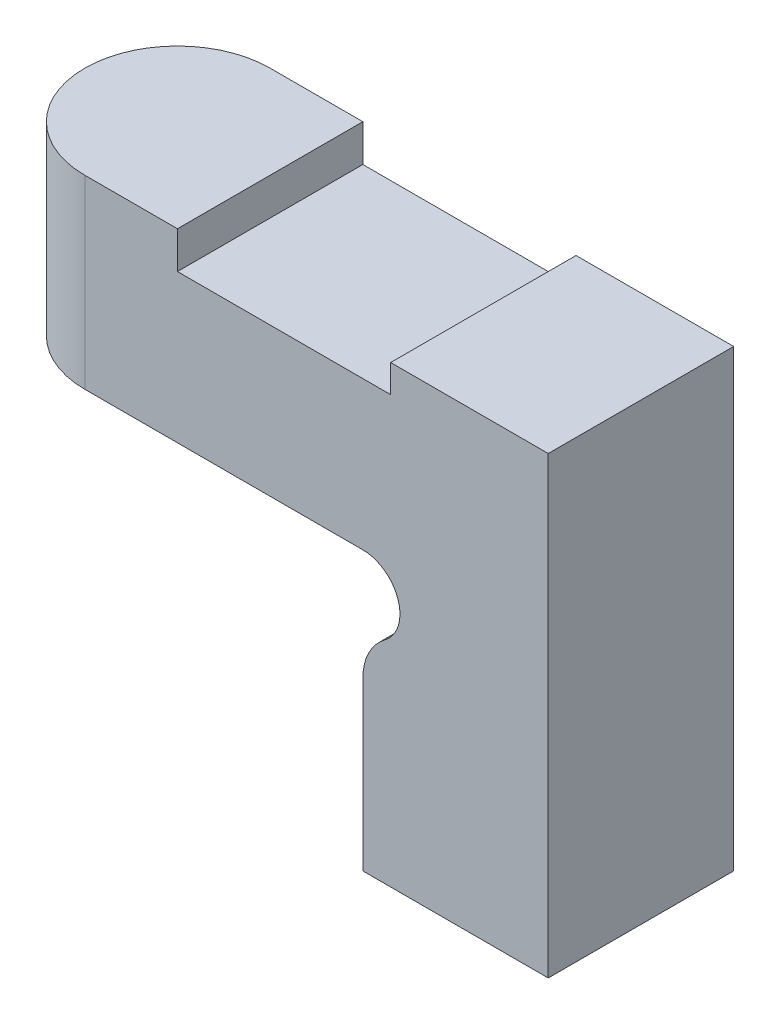
ISO-10303-21;
HEADER;
FILE_DESCRIPTION(('STEP AP214'),'2;1');
FILE_NAME('part.step','',(''),(''),'','','');
FILE_SCHEMA(('AUTOMOTIVE_DESIGN { 1 0 10303 214 1 1 1 1 }'));
ENDSEC;
DATA;
#1=APPLICATION_CONTEXT('core data for automotive mechanical design processes');
#2=APPLICATION_PROTOCOL_DEFINITION('international standard','automotive_design',2000,#1);
#3=PRODUCT_CONTEXT('',#1,'mechanical');
#4=PRODUCT('Part','Part','',(#3));
#5=PRODUCT_RELATED_PRODUCT_CATEGORY('part','',(#4));
#6=PRODUCT_DEFINITION_FORMATION('','',#4);
#7=PRODUCT_DEFINITION_CONTEXT('part definition',#1,'design');
#8=PRODUCT_DEFINITION('design','',#6,#7);
#9=PRODUCT_DEFINITION_SHAPE('','',#8);
#10=(LENGTH_UNIT() NAMED_UNIT(*) SI_UNIT(.MILLI.,.METRE.));
#11=(NAMED_UNIT(*) PLANE_ANGLE_UNIT() SI_UNIT($,.RADIAN.));
#12=(NAMED_UNIT(*) SI_UNIT($,.STERADIAN.) SOLID_ANGLE_UNIT());
#13=UNCERTAINTY_MEASURE_WITH_UNIT(LENGTH_MEASURE(1.E-05),#10,'distance_accuracy_value','');
#14=(GEOMETRIC_REPRESENTATION_CONTEXT(3) GLOBAL_UNCERTAINTY_ASSIGNED_CONTEXT((#13)) GLOBAL_UNIT_ASSIGNED_CONTEXT((#10,
#11,#12)) REPRESENTATION_CONTEXT('',''));
#15=CARTESIAN_POINT('',(0.,0.,0.));
#16=DIRECTION('',(0.,0.,1.));
#17=DIRECTION('',(1.,0.,0.));
#18=AXIS2_PLACEMENT_3D('',#15,#16,#17);
#19=CARTESIAN_POINT('',(20.,10.,0.));
#20=DIRECTION('',(0.,0.,1.));
#21=DIRECTION('',(-1.,0.,0.));
#22=AXIS2_PLACEMENT_3D('',#19,#20,#21);
#23=PLANE('',#22);
#24=CARTESIAN_POINT('',(25.,-10.,0.));
#25=DIRECTION('',(0.,0.,1.));
#26=DIRECTION('',(1.,0.,0.));
#27=AXIS2_PLACEMENT_3D('',#24,#25,#26);
#28=CIRCLE('',#27,2.);
#29=CARTESIAN_POINT('',(27.,-10.,0.));
#30=VERTEX_POINT('',#29);
#31=EDGE_CURVE('E187',#30,#30,#28,.T.);
#32=ORIENTED_EDGE('',*,*,#31,.T.);
#33=EDGE_LOOP('',(#32));
#34=FACE_BOUND('',#33,.T.);
#35=CARTESIAN_POINT('',(25.,3.,0.));
#36=DIRECTION('',(0.,0.,1.));
#37=DIRECTION('',(1.,0.,0.));
#38=AXIS2_PLACEMENT_3D('',#35,#36,#37);
#39=CIRCLE('',#38,2.);
#40=CARTESIAN_POINT('',(27.,3.,0.));
#41=VERTEX_POINT('',#40);
#42=EDGE_CURVE('E190',#41,#41,#39,.T.);
#43=ORIENTED_EDGE('',*,*,#42,.T.);
#44=EDGE_LOOP('',(#43));
#45=FACE_BOUND('',#44,.T.);
#46=CARTESIAN_POINT('',(20.,-2.,0.));
#47=DIRECTION('',(0.,0.,-1.));
#48=DIRECTION('',(-1.,0.,0.));
#49=AXIS2_PLACEMENT_3D('',#46,#47,#48);
#50=CIRCLE('',#49,2.);
#51=CARTESIAN_POINT('',(20.,0.,0.));
#52=VERTEX_POINT('',#51);
#53=CARTESIAN_POINT('',(21.2,-3.6,0.));
#54=VERTEX_POINT('',#53);
#55=EDGE_CURVE('E147',#52,#54,#50,.T.);
#56=ORIENTED_EDGE('',*,*,#55,.F.);
#57=DIRECTION('',(1.,0.,0.));
#58=VECTOR('',#57,1.);
#59=CARTESIAN_POINT('',(20.,0.,0.));
#60=LINE('',#59,#58);
#61=CARTESIAN_POINT('',(5.,0.,0.));
#62=VERTEX_POINT('',#61);
#63=EDGE_CURVE('E136',#62,#52,#60,.T.);
#64=ORIENTED_EDGE('',*,*,#63,.F.);
#65=DIRECTION('',(0.,-1.,0.));
#66=VECTOR('',#65,1.);
#67=CARTESIAN_POINT('',(5.,10.,0.));
#68=LINE('',#67,#66);
#69=CARTESIAN_POINT('',(5.,10.,0.));
#70=VERTEX_POINT('',#69);
#71=EDGE_CURVE('E171',#70,#62,#68,.T.);
#72=ORIENTED_EDGE('',*,*,#71,.F.);
#73=DIRECTION('',(1.,0.,0.));
#74=VECTOR('',#73,1.);
#75=CARTESIAN_POINT('',(0.,10.,0.));
#76=LINE('',#75,#74);
#77=CARTESIAN_POINT('',(10.,10.,0.));
#78=VERTEX_POINT('',#77);
#79=EDGE_CURVE('E154',#70,#78,#76,.T.);
#80=ORIENTED_EDGE('',*,*,#79,.T.);
#81=DIRECTION('',(0.,1.,0.));
#82=VECTOR('',#81,1.);
#83=CARTESIAN_POINT('',(10.,10.,0.));
#84=LINE('',#83,#82);
#85=CARTESIAN_POINT('',(10.,8.,0.));
#86=VERTEX_POINT('',#85);
#87=EDGE_CURVE('E231',#86,#78,#84,.T.);
#88=ORIENTED_EDGE('',*,*,#87,.F.);
#89=DIRECTION('',(-1.,0.,0.));
#90=VECTOR('',#89,1.);
#91=CARTESIAN_POINT('',(20.,8.,0.));
#92=LINE('',#91,#90);
#93=CARTESIAN_POINT('',(21.5,8.,0.));
#94=VERTEX_POINT('',#93);
#95=EDGE_CURVE('E159',#94,#86,#92,.T.);
#96=ORIENTED_EDGE('',*,*,#95,.F.);
#97=DIRECTION('',(0.,-1.,0.));
#98=VECTOR('',#97,1.);
#99=CARTESIAN_POINT('',(21.5,10.,0.));
#100=LINE('',#99,#98);
#101=CARTESIAN_POINT('',(21.5,9.5,0.));
#102=VERTEX_POINT('',#101);
#103=EDGE_CURVE('E236',#102,#94,#100,.T.);
#104=ORIENTED_EDGE('',*,*,#103,.F.);
#105=DIRECTION('',(1.,0.,0.));
#106=VECTOR('',#105,1.);
#107=CARTESIAN_POINT('',(21.5,9.5,0.));
#108=LINE('',#107,#106);
#109=CARTESIAN_POINT('',(30.,9.5,0.));
#110=VERTEX_POINT('',#109);
#111=EDGE_CURVE('E184',#102,#110,#108,.T.);
#112=ORIENTED_EDGE('',*,*,#111,.T.);
#113=DIRECTION('',(0.,-1.,0.));
#114=VECTOR('',#113,1.);
#115=CARTESIAN_POINT('',(30.,10.,0.));
#116=LINE('',#115,#114);
#117=CARTESIAN_POINT('',(30.,-15.,0.));
#118=VERTEX_POINT('',#117);
#119=EDGE_CURVE('E245',#110,#118,#116,.T.);
#120=ORIENTED_EDGE('',*,*,#119,.T.);
#121=DIRECTION('',(-1.,0.,0.));
#122=VECTOR('',#121,1.);
#123=CARTESIAN_POINT('',(20.,-15.,0.));
#124=LINE('',#123,#122);
#125=CARTESIAN_POINT('',(20.,-15.,0.));
#126=VERTEX_POINT('',#125);
#127=EDGE_CURVE('E203',#118,#126,#124,.T.);
#128=ORIENTED_EDGE('',*,*,#127,.T.);
#129=DIRECTION('',(0.,1.,0.));
#130=VECTOR('',#129,1.);
#131=CARTESIAN_POINT('',(20.,-15.,0.));
#132=LINE('',#131,#130);
#133=CARTESIAN_POINT('',(20.,-6.00000000000001,0.));
#134=VERTEX_POINT('',#133);
#135=EDGE_CURVE('E206',#126,#134,#132,.T.);
#136=ORIENTED_EDGE('',*,*,#135,.T.);
#137=CARTESIAN_POINT('',(23.,-6.,0.));
#138=DIRECTION('',(0.,0.,-1.));
#139=DIRECTION('',(-1.,0.,0.));
#140=AXIS2_PLACEMENT_3D('',#137,#138,#139);
#141=CIRCLE('',#140,3.);
#142=EDGE_CURVE('E11',#54,#134,#141,.F.);
#143=ORIENTED_EDGE('',*,*,#142,.F.);
#144=EDGE_LOOP('',(#56,#64,#72,#80,#88,#96,#104,#112,#120,#128,#136,#143));
#145=FACE_BOUND('',#144,.T.);
#146=ADVANCED_FACE('F35',(#34,#45,#145),#23,.F.);
#147=CARTESIAN_POINT('',(30.,10.,0.));
#148=DIRECTION('',(-1.,0.,0.));
#149=DIRECTION('',(0.,0.,-1.));
#150=AXIS2_PLACEMENT_3D('',#147,#148,#149);
#151=PLANE('',#150);
#152=DIRECTION('',(0.,0.,1.));
#153=VECTOR('',#152,1.);
#154=CARTESIAN_POINT('',(30.,9.5,0.));
#155=LINE('',#154,#153);
#156=CARTESIAN_POINT('',(30.,9.5,10.));
#157=VERTEX_POINT('',#156);
#158=EDGE_CURVE('E146',#110,#157,#155,.T.);
#159=ORIENTED_EDGE('',*,*,#158,.T.);
#160=DIRECTION('',(0.,-1.,0.));
#161=VECTOR('',#160,1.);
#162=CARTESIAN_POINT('',(30.,10.,10.));
#163=LINE('',#162,#161);
#164=CARTESIAN_POINT('',(30.,-15.,10.));
#165=VERTEX_POINT('',#164);
#166=EDGE_CURVE('E241',#157,#165,#163,.T.);
#167=ORIENTED_EDGE('',*,*,#166,.T.);
#168=DIRECTION('',(0.,0.,-1.));
#169=VECTOR('',#168,1.);
#170=CARTESIAN_POINT('',(30.,-15.,0.));
#171=LINE('',#170,#169);
#172=EDGE_CURVE('E201',#165,#118,#171,.T.);
#173=ORIENTED_EDGE('',*,*,#172,.T.);
#174=ORIENTED_EDGE('',*,*,#119,.F.);
#175=EDGE_LOOP('',(#159,#167,#173,#174));
#176=FACE_BOUND('',#175,.T.);
#177=ADVANCED_FACE('F277',(#176),#151,.F.);
#178=CARTESIAN_POINT('',(0.,10.,10.));
#179=DIRECTION('',(0.,0.,-1.));
#180=DIRECTION('',(1.,0.,0.));
#181=AXIS2_PLACEMENT_3D('',#178,#179,#180);
#182=PLANE('',#181);
#183=DIRECTION('',(0.,1.,0.));
#184=VECTOR('',#183,1.);
#185=CARTESIAN_POINT('',(20.,-15.,10.));
#186=LINE('',#185,#184);
#187=CARTESIAN_POINT('',(20.,-15.,10.));
#188=VERTEX_POINT('',#187);
#189=CARTESIAN_POINT('',(20.,-6.00000000000001,10.));
#190=VERTEX_POINT('',#189);
#191=EDGE_CURVE('E209',#188,#190,#186,.T.);
#192=ORIENTED_EDGE('',*,*,#191,.F.);
#193=DIRECTION('',(1.,0.,0.));
#194=VECTOR('',#193,1.);
#195=CARTESIAN_POINT('',(20.,-15.,10.));
#196=LINE('',#195,#194);
#197=EDGE_CURVE('E199',#188,#165,#196,.T.);
#198=ORIENTED_EDGE('',*,*,#197,.T.);
#199=ORIENTED_EDGE('',*,*,#166,.F.);
#200=DIRECTION('',(-1.,0.,0.));
#201=VECTOR('',#200,1.);
#202=CARTESIAN_POINT('',(30.,9.5,10.));
#203=LINE('',#202,#201);
#204=CARTESIAN_POINT('',(21.5,9.5,10.));
#205=VERTEX_POINT('',#204);
#206=EDGE_CURVE('E179',#157,#205,#203,.T.);
#207=ORIENTED_EDGE('',*,*,#206,.T.);
#208=DIRECTION('',(0.,1.,0.));
#209=VECTOR('',#208,1.);
#210=CARTESIAN_POINT('',(21.5,8.,10.));
#211=LINE('',#210,#209);
#212=CARTESIAN_POINT('',(21.5,8.,10.));
#213=VERTEX_POINT('',#212);
#214=EDGE_CURVE('E226',#213,#205,#211,.T.);
#215=ORIENTED_EDGE('',*,*,#214,.F.);
#216=DIRECTION('',(-1.,0.,0.));
#217=VECTOR('',#216,1.);
#218=CARTESIAN_POINT('',(21.5,8.,10.));
#219=LINE('',#218,#217);
#220=CARTESIAN_POINT('',(10.,8.,10.));
#221=VERTEX_POINT('',#220);
#222=EDGE_CURVE('E220',#213,#221,#219,.T.);
#223=ORIENTED_EDGE('',*,*,#222,.T.);
#224=DIRECTION('',(0.,1.,0.));
#225=VECTOR('',#224,1.);
#226=CARTESIAN_POINT('',(10.,8.,10.));
#227=LINE('',#226,#225);
#228=CARTESIAN_POINT('',(10.,10.,10.));
#229=VERTEX_POINT('',#228);
#230=EDGE_CURVE('E228',#221,#229,#227,.T.);
#231=ORIENTED_EDGE('',*,*,#230,.T.);
#232=DIRECTION('',(-1.,0.,0.));
#233=VECTOR('',#232,1.);
#234=CARTESIAN_POINT('',(0.,10.,10.));
#235=LINE('',#234,#233);
#236=CARTESIAN_POINT('',(5.,10.,10.));
#237=VERTEX_POINT('',#236);
#238=EDGE_CURVE('E157',#229,#237,#235,.T.);
#239=ORIENTED_EDGE('',*,*,#238,.T.);
#240=DIRECTION('',(0.,-1.,0.));
#241=VECTOR('',#240,1.);
#242=CARTESIAN_POINT('',(5.,10.,10.));
#243=LINE('',#242,#241);
#244=CARTESIAN_POINT('',(5.,0.,10.));
#245=VERTEX_POINT('',#244);
#246=EDGE_CURVE('E153',#245,#237,#243,.F.);
#247=ORIENTED_EDGE('',*,*,#246,.F.);
#248=DIRECTION('',(-1.,0.,0.));
#249=VECTOR('',#248,1.);
#250=CARTESIAN_POINT('',(0.,0.,10.));
#251=LINE('',#250,#249);
#252=CARTESIAN_POINT('',(20.,0.,10.0000065));
#253=VERTEX_POINT('',#252);
#254=EDGE_CURVE('E133',#253,#245,#251,.T.);
#255=ORIENTED_EDGE('',*,*,#254,.F.);
#256=CARTESIAN_POINT('',(20.,-2.,10.));
#257=DIRECTION('',(0.,0.,1.));
#258=DIRECTION('',(1.,0.,0.));
#259=AXIS2_PLACEMENT_3D('',#256,#257,#258);
#260=CIRCLE('',#259,2.);
#261=CARTESIAN_POINT('',(21.2,-3.6,10.));
#262=VERTEX_POINT('',#261);
#263=EDGE_CURVE('E142',#262,#253,#260,.T.);
#264=ORIENTED_EDGE('',*,*,#263,.F.);
#265=CARTESIAN_POINT('',(23.,-6.,10.));
#266=DIRECTION('',(0.,0.,1.));
#267=DIRECTION('',(1.,0.,0.));
#268=AXIS2_PLACEMENT_3D('',#265,#266,#267);
#269=CIRCLE('',#268,3.);
#270=EDGE_CURVE('E170',#190,#262,#269,.F.);
#271=ORIENTED_EDGE('',*,*,#270,.F.);
#272=EDGE_LOOP('',(#192,#198,#199,#207,#215,#223,#231,#239,#247,#255,#264,#271));
#273=FACE_BOUND('',#272,.T.);
#274=ADVANCED_FACE('F150',(#273),#182,.F.);
#275=CARTESIAN_POINT('',(21.5,8.,10.));
#276=DIRECTION('',(1.,0.,0.));
#277=DIRECTION('',(0.,0.,1.));
#278=AXIS2_PLACEMENT_3D('',#275,#276,#277);
#279=PLANE('',#278);
#280=DIRECTION('',(0.,0.,-1.));
#281=VECTOR('',#280,1.);
#282=CARTESIAN_POINT('',(21.5,9.5,10.));
#283=LINE('',#282,#281);
#284=EDGE_CURVE('E182',#205,#102,#283,.T.);
#285=ORIENTED_EDGE('',*,*,#284,.T.);
#286=ORIENTED_EDGE('',*,*,#103,.T.);
#287=DIRECTION('',(0.,0.,1.));
#288=VECTOR('',#287,1.);
#289=CARTESIAN_POINT('',(21.5,8.,10.));
#290=LINE('',#289,#288);
#291=EDGE_CURVE('E218',#94,#213,#290,.T.);
#292=ORIENTED_EDGE('',*,*,#291,.T.);
#293=ORIENTED_EDGE('',*,*,#214,.T.);
#294=EDGE_LOOP('',(#285,#286,#292,#293));
#295=FACE_BOUND('',#294,.T.);
#296=ADVANCED_FACE('F283',(#295),#279,.F.);
#297=CARTESIAN_POINT('',(0.,10.,0.));
#298=DIRECTION('',(0.,-1.,0.));
#299=DIRECTION('',(0.,0.,1.));
#300=AXIS2_PLACEMENT_3D('',#297,#298,#299);
#301=PLANE('',#300);
#302=ORIENTED_EDGE('',*,*,#238,.F.);
#303=DIRECTION('',(0.,0.,-1.));
#304=VECTOR('',#303,1.);
#305=CARTESIAN_POINT('',(10.,10.,10.));
#306=LINE('',#305,#304);
#307=EDGE_CURVE('E221',#229,#78,#306,.T.);
#308=ORIENTED_EDGE('',*,*,#307,.T.);
#309=ORIENTED_EDGE('',*,*,#79,.F.);
#310=CARTESIAN_POINT('',(5.,10.,5.));
#311=DIRECTION('',(0.,1.,0.));
#312=DIRECTION('',(0.,0.,1.));
#313=AXIS2_PLACEMENT_3D('',#310,#311,#312);
#314=CIRCLE('',#313,5.);
#315=CARTESIAN_POINT('',(0.,10.,5.));
#316=VERTEX_POINT('',#315);
#317=EDGE_CURVE('E254',#316,#70,#314,.F.);
#318=ORIENTED_EDGE('',*,*,#317,.F.);
#319=CARTESIAN_POINT('',(5.,10.,5.));
#320=DIRECTION('',(0.,1.,0.));
#321=DIRECTION('',(0.,0.,1.));
#322=AXIS2_PLACEMENT_3D('',#319,#320,#321);
#323=CIRCLE('',#322,5.);
#324=EDGE_CURVE('E256',#237,#316,#323,.F.);
#325=ORIENTED_EDGE('',*,*,#324,.F.);
#326=EDGE_LOOP('',(#302,#308,#309,#318,#325));
#327=FACE_BOUND('',#326,.T.);
#328=ADVANCED_FACE('F294',(#327),#301,.F.);
#329=CARTESIAN_POINT('',(0.,0.,0.));
#330=DIRECTION('',(0.,-1.,0.));
#331=DIRECTION('',(0.,0.,1.));
#332=AXIS2_PLACEMENT_3D('',#329,#330,#331);
#333=PLANE('',#332);
#334=DIRECTION('',(0.,0.,1.));
#335=VECTOR('',#334,1.);
#336=CARTESIAN_POINT('',(20.,0.,0.));
#337=LINE('',#336,#335);
#338=EDGE_CURVE('E128',#52,#253,#337,.T.);
#339=ORIENTED_EDGE('',*,*,#338,.T.);
#340=ORIENTED_EDGE('',*,*,#254,.T.);
#341=CARTESIAN_POINT('',(5.,0.,5.));
#342=DIRECTION('',(0.,1.,0.));
#343=DIRECTION('',(0.,0.,1.));
#344=AXIS2_PLACEMENT_3D('',#341,#342,#343);
#345=CIRCLE('',#344,5.);
#346=CARTESIAN_POINT('',(0.,0.,5.));
#347=VERTEX_POINT('',#346);
#348=EDGE_CURVE('E251',#347,#245,#345,.T.);
#349=ORIENTED_EDGE('',*,*,#348,.F.);
#350=CARTESIAN_POINT('',(5.,0.,5.));
#351=DIRECTION('',(0.,1.,0.));
#352=DIRECTION('',(0.,0.,1.));
#353=AXIS2_PLACEMENT_3D('',#350,#351,#352);
#354=CIRCLE('',#353,5.);
#355=EDGE_CURVE('E248',#62,#347,#354,.T.);
#356=ORIENTED_EDGE('',*,*,#355,.F.);
#357=ORIENTED_EDGE('',*,*,#63,.T.);
#358=EDGE_LOOP('',(#339,#340,#349,#356,#357));
#359=FACE_BOUND('',#358,.T.);
#360=CARTESIAN_POINT('',(6.5,0.,5.));
#361=DIRECTION('',(0.,1.,0.));
#362=DIRECTION('',(0.,0.,1.));
#363=AXIS2_PLACEMENT_3D('',#360,#361,#362);
#364=CIRCLE('',#363,2.15);
#365=CARTESIAN_POINT('',(6.5,0.,7.15));
#366=VERTEX_POINT('',#365);
#367=EDGE_CURVE('E212',#366,#366,#364,.T.);
#368=ORIENTED_EDGE('',*,*,#367,.T.);
#369=EDGE_LOOP('',(#368));
#370=FACE_BOUND('',#369,.T.);
#371=ADVANCED_FACE('F129',(#359,#370),#333,.T.);
#372=CARTESIAN_POINT('',(0.,8.,0.));
#373=DIRECTION('',(0.,-1.,0.));
#374=DIRECTION('',(0.,0.,1.));
#375=AXIS2_PLACEMENT_3D('',#372,#373,#374);
#376=PLANE('',#375);
#377=ORIENTED_EDGE('',*,*,#291,.F.);
#378=ORIENTED_EDGE('',*,*,#95,.T.);
#379=DIRECTION('',(0.,0.,-1.));
#380=VECTOR('',#379,1.);
#381=CARTESIAN_POINT('',(10.,8.,10.));
#382=LINE('',#381,#380);
#383=EDGE_CURVE('E224',#221,#86,#382,.T.);
#384=ORIENTED_EDGE('',*,*,#383,.F.);
#385=ORIENTED_EDGE('',*,*,#222,.F.);
#386=EDGE_LOOP('',(#377,#378,#384,#385));
#387=FACE_BOUND('',#386,.T.);
#388=ADVANCED_FACE('F287',(#387),#376,.F.);
#389=CARTESIAN_POINT('',(10.,8.,10.));
#390=DIRECTION('',(-1.,0.,0.));
#391=DIRECTION('',(0.,0.,-1.));
#392=AXIS2_PLACEMENT_3D('',#389,#390,#391);
#393=PLANE('',#392);
#394=ORIENTED_EDGE('',*,*,#383,.T.);
#395=ORIENTED_EDGE('',*,*,#87,.T.);
#396=ORIENTED_EDGE('',*,*,#307,.F.);
#397=ORIENTED_EDGE('',*,*,#230,.F.);
#398=EDGE_LOOP('',(#394,#395,#396,#397));
#399=FACE_BOUND('',#398,.T.);
#400=ADVANCED_FACE('F291',(#399),#393,.F.);
#401=CARTESIAN_POINT('',(5.,10.,5.));
#402=DIRECTION('',(0.,-1.,0.));
#403=DIRECTION('',(0.,0.,1.));
#404=AXIS2_PLACEMENT_3D('',#401,#402,#403);
#405=CYLINDRICAL_SURFACE('',#404,5.);
#406=ORIENTED_EDGE('',*,*,#71,.T.);
#407=ORIENTED_EDGE('',*,*,#355,.T.);
#408=DIRECTION('',(0.,-1.,0.));
#409=VECTOR('',#408,1.);
#410=CARTESIAN_POINT('',(0.,10.,5.));
#411=LINE('',#410,#409);
#412=EDGE_CURVE('E163',#347,#316,#411,.F.);
#413=ORIENTED_EDGE('',*,*,#412,.T.);
#414=ORIENTED_EDGE('',*,*,#317,.T.);
#415=EDGE_LOOP('',(#406,#407,#413,#414));
#416=FACE_BOUND('',#415,.T.);
#417=ADVANCED_FACE('F261',(#416),#405,.T.);
#418=CARTESIAN_POINT('',(5.,10.,5.));
#419=DIRECTION('',(0.,-1.,0.));
#420=DIRECTION('',(0.,0.,1.));
#421=AXIS2_PLACEMENT_3D('',#418,#419,#420);
#422=CYLINDRICAL_SURFACE('',#421,5.);
#423=ORIENTED_EDGE('',*,*,#324,.T.);
#424=ORIENTED_EDGE('',*,*,#412,.F.);
#425=ORIENTED_EDGE('',*,*,#348,.T.);
#426=ORIENTED_EDGE('',*,*,#246,.T.);
#427=EDGE_LOOP('',(#423,#424,#425,#426));
#428=FACE_BOUND('',#427,.T.);
#429=ADVANCED_FACE('F296',(#428),#422,.T.);
#430=CARTESIAN_POINT('',(6.5,5.,5.));
#431=DIRECTION('',(0.,-1.,0.));
#432=DIRECTION('',(0.,0.,1.));
#433=AXIS2_PLACEMENT_3D('',#430,#431,#432);
#434=CYLINDRICAL_SURFACE('',#433,2.15);
#435=CARTESIAN_POINT('',(6.5,5.,5.));
#436=DIRECTION('',(0.,1.,0.));
#437=DIRECTION('',(0.,0.,1.));
#438=AXIS2_PLACEMENT_3D('',#435,#436,#437);
#439=CIRCLE('',#438,2.15);
#440=CARTESIAN_POINT('',(6.5,5.,7.15));
#441=VERTEX_POINT('',#440);
#442=EDGE_CURVE('E213',#441,#441,#439,.T.);
#443=ORIENTED_EDGE('',*,*,#442,.T.);
#444=EDGE_LOOP('',(#443));
#445=FACE_BOUND('',#444,.T.);
#446=ORIENTED_EDGE('',*,*,#367,.F.);
#447=EDGE_LOOP('',(#446));
#448=FACE_BOUND('',#447,.T.);
#449=ADVANCED_FACE('F298',(#445,#448),#434,.F.);
#450=CARTESIAN_POINT('',(6.5,5.,5.));
#451=DIRECTION('',(0.,-1.,0.));
#452=DIRECTION('',(0.,0.,1.));
#453=AXIS2_PLACEMENT_3D('',#450,#451,#452);
#454=PLANE('',#453);
#455=ORIENTED_EDGE('',*,*,#442,.F.);
#456=EDGE_LOOP('',(#455));
#457=FACE_BOUND('',#456,.T.);
#458=ADVANCED_FACE('F304',(#457),#454,.T.);
#459=CARTESIAN_POINT('',(20.,-15.,0.));
#460=DIRECTION('',(1.,0.,0.));
#461=DIRECTION('',(0.,0.,1.));
#462=AXIS2_PLACEMENT_3D('',#459,#460,#461);
#463=PLANE('',#462);
#464=ORIENTED_EDGE('',*,*,#135,.F.);
#465=DIRECTION('',(0.,0.,1.));
#466=VECTOR('',#465,1.);
#467=CARTESIAN_POINT('',(20.,-15.,0.));
#468=LINE('',#467,#466);
#469=EDGE_CURVE('E138',#126,#188,#468,.T.);
#470=ORIENTED_EDGE('',*,*,#469,.T.);
#471=ORIENTED_EDGE('',*,*,#191,.T.);
#472=DIRECTION('',(0.,0.,1.));
#473=VECTOR('',#472,1.);
#474=CARTESIAN_POINT('',(20.,-6.00000000000001,0.));
#475=LINE('',#474,#473);
#476=EDGE_CURVE('E169',#134,#190,#475,.T.);
#477=ORIENTED_EDGE('',*,*,#476,.F.);
#478=EDGE_LOOP('',(#464,#470,#471,#477));
#479=FACE_BOUND('',#478,.T.);
#480=ADVANCED_FACE('F267',(#479),#463,.F.);
#481=CARTESIAN_POINT('',(0.,-15.,0.));
#482=DIRECTION('',(0.,-1.,0.));
#483=DIRECTION('',(0.,0.,1.));
#484=AXIS2_PLACEMENT_3D('',#481,#482,#483);
#485=PLANE('',#484);
#486=ORIENTED_EDGE('',*,*,#469,.F.);
#487=ORIENTED_EDGE('',*,*,#127,.F.);
#488=ORIENTED_EDGE('',*,*,#172,.F.);
#489=ORIENTED_EDGE('',*,*,#197,.F.);
#490=EDGE_LOOP('',(#486,#487,#488,#489));
#491=FACE_BOUND('',#490,.T.);
#492=ADVANCED_FACE('F272',(#491),#485,.T.);
#493=CARTESIAN_POINT('',(25.,-10.,7.));
#494=DIRECTION('',(0.,0.,-1.));
#495=DIRECTION('',(1.,0.,0.));
#496=AXIS2_PLACEMENT_3D('',#493,#494,#495);
#497=CYLINDRICAL_SURFACE('',#496,2.);
#498=CARTESIAN_POINT('',(25.,-10.,7.));
#499=DIRECTION('',(0.,0.,1.));
#500=DIRECTION('',(1.,0.,0.));
#501=AXIS2_PLACEMENT_3D('',#498,#499,#500);
#502=CIRCLE('',#501,2.);
#503=CARTESIAN_POINT('',(27.,-10.,7.));
#504=VERTEX_POINT('',#503);
#505=EDGE_CURVE('E193',#504,#504,#502,.T.);
#506=ORIENTED_EDGE('',*,*,#505,.T.);
#507=EDGE_LOOP('',(#506));
#508=FACE_BOUND('',#507,.T.);
#509=ORIENTED_EDGE('',*,*,#31,.F.);
#510=EDGE_LOOP('',(#509));
#511=FACE_BOUND('',#510,.T.);
#512=ADVANCED_FACE('F335',(#508,#511),#497,.F.);
#513=CARTESIAN_POINT('',(25.,-10.,7.));
#514=DIRECTION('',(0.,0.,-1.));
#515=DIRECTION('',(1.,0.,0.));
#516=AXIS2_PLACEMENT_3D('',#513,#514,#515);
#517=PLANE('',#516);
#518=ORIENTED_EDGE('',*,*,#505,.F.);
#519=EDGE_LOOP('',(#518));
#520=FACE_BOUND('',#519,.T.);
#521=ADVANCED_FACE('F338',(#520),#517,.T.);
#522=CARTESIAN_POINT('',(25.,3.,7.));
#523=DIRECTION('',(0.,0.,-1.));
#524=DIRECTION('',(1.,0.,0.));
#525=AXIS2_PLACEMENT_3D('',#522,#523,#524);
#526=CYLINDRICAL_SURFACE('',#525,2.);
#527=CARTESIAN_POINT('',(25.,3.,7.));
#528=DIRECTION('',(0.,0.,1.));
#529=DIRECTION('',(1.,0.,0.));
#530=AXIS2_PLACEMENT_3D('',#527,#528,#529);
#531=CIRCLE('',#530,2.);
#532=CARTESIAN_POINT('',(27.,3.,7.));
#533=VERTEX_POINT('',#532);
#534=EDGE_CURVE('E139',#533,#533,#531,.T.);
#535=ORIENTED_EDGE('',*,*,#534,.T.);
#536=EDGE_LOOP('',(#535));
#537=FACE_BOUND('',#536,.T.);
#538=ORIENTED_EDGE('',*,*,#42,.F.);
#539=EDGE_LOOP('',(#538));
#540=FACE_BOUND('',#539,.T.);
#541=ADVANCED_FACE('F342',(#537,#540),#526,.F.);
#542=CARTESIAN_POINT('',(25.,3.,7.));
#543=DIRECTION('',(0.,0.,-1.));
#544=DIRECTION('',(1.,0.,0.));
#545=AXIS2_PLACEMENT_3D('',#542,#543,#544);
#546=PLANE('',#545);
#547=ORIENTED_EDGE('',*,*,#534,.F.);
#548=EDGE_LOOP('',(#547));
#549=FACE_BOUND('',#548,.T.);
#550=ADVANCED_FACE('F346',(#549),#546,.T.);
#551=CARTESIAN_POINT('',(0.,9.5,0.));
#552=DIRECTION('',(0.,1.,0.));
#553=DIRECTION('',(0.,0.,-1.));
#554=AXIS2_PLACEMENT_3D('',#551,#552,#553);
#555=PLANE('',#554);
#556=ORIENTED_EDGE('',*,*,#158,.F.);
#557=ORIENTED_EDGE('',*,*,#111,.F.);
#558=ORIENTED_EDGE('',*,*,#284,.F.);
#559=ORIENTED_EDGE('',*,*,#206,.F.);
#560=EDGE_LOOP('',(#556,#557,#558,#559));
#561=FACE_BOUND('',#560,.T.);
#562=ADVANCED_FACE('F280',(#561),#555,.T.);
#563=CARTESIAN_POINT('',(20.,-2.,0.));
#564=DIRECTION('',(0.,0.,1.));
#565=DIRECTION('',(-1.,0.,0.));
#566=AXIS2_PLACEMENT_3D('',#563,#564,#565);
#567=CYLINDRICAL_SURFACE('',#566,2.);
#568=ORIENTED_EDGE('',*,*,#263,.T.);
#569=ORIENTED_EDGE('',*,*,#338,.F.);
#570=ORIENTED_EDGE('',*,*,#55,.T.);
#571=DIRECTION('',(0.,0.,1.));
#572=VECTOR('',#571,1.);
#573=CARTESIAN_POINT('',(21.2,-3.6,0.));
#574=LINE('',#573,#572);
#575=EDGE_CURVE('E43',#262,#54,#574,.F.);
#576=ORIENTED_EDGE('',*,*,#575,.F.);
#577=EDGE_LOOP('',(#568,#569,#570,#576));
#578=FACE_BOUND('',#577,.T.);
#579=ADVANCED_FACE('F143',(#578),#567,.F.);
#580=CARTESIAN_POINT('',(23.,-6.,0.));
#581=DIRECTION('',(0.,0.,1.));
#582=DIRECTION('',(-1.,0.,0.));
#583=AXIS2_PLACEMENT_3D('',#580,#581,#582);
#584=CYLINDRICAL_SURFACE('',#583,3.);
#585=ORIENTED_EDGE('',*,*,#142,.T.);
#586=ORIENTED_EDGE('',*,*,#476,.T.);
#587=ORIENTED_EDGE('',*,*,#270,.T.);
#588=ORIENTED_EDGE('',*,*,#575,.T.);
#589=EDGE_LOOP('',(#585,#586,#587,#588));
#590=FACE_BOUND('',#589,.T.);
#591=ADVANCED_FACE('F37',(#590),#584,.T.);
#592=CLOSED_SHELL('',(#146,#177,#274,#296,#328,#371,#388,#400,#417,#429,#449,#458,#480,#492,
#512,#521,#541,#550,#562,#579,#591));
#593=MANIFOLD_SOLID_BREP('B2',#592);
#594=ADVANCED_BREP_SHAPE_REPRESENTATION('',(#18,#593),#14);
#595=SHAPE_DEFINITION_REPRESENTATION(#9,#594);
ENDSEC;
END-ISO-10303-21;
